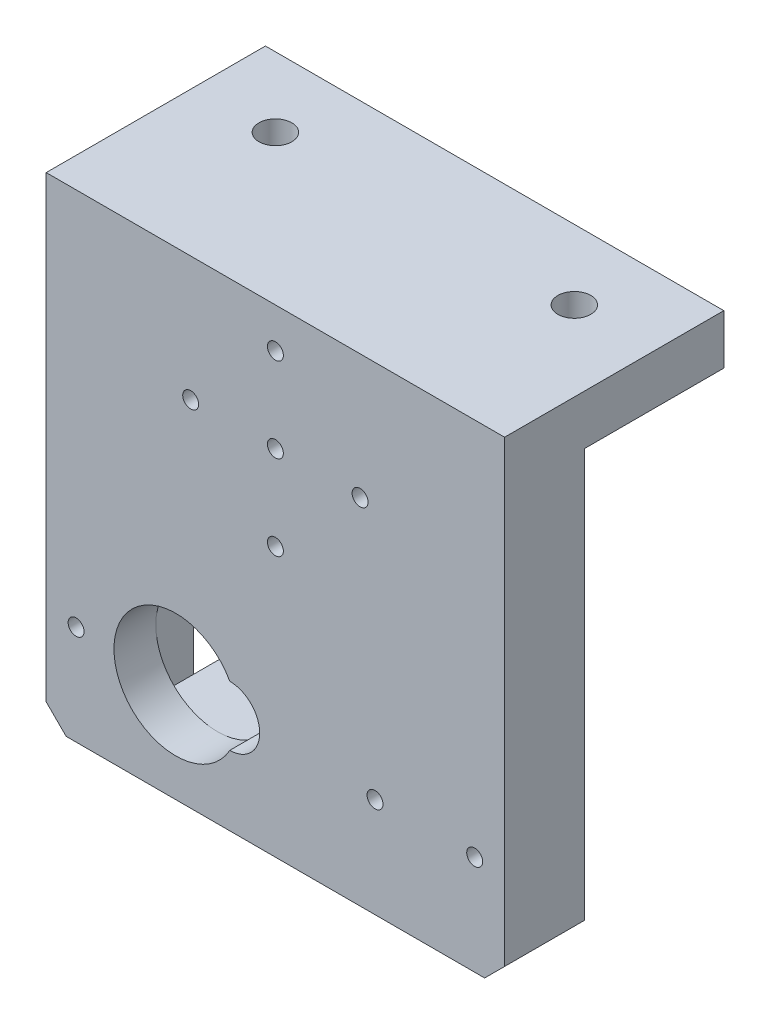
ISO-10303-21;
HEADER;
FILE_DESCRIPTION(('STEP AP214'),'2;1');
FILE_NAME('part.step','',(''),(''),'','','');
FILE_SCHEMA(('AUTOMOTIVE_DESIGN { 1 0 10303 214 1 1 1 1 }'));
ENDSEC;
DATA;
#1=APPLICATION_CONTEXT('core data for automotive mechanical design processes');
#2=APPLICATION_PROTOCOL_DEFINITION('international standard','automotive_design',2000,#1);
#3=PRODUCT_CONTEXT('',#1,'mechanical');
#4=PRODUCT('Part','Part','',(#3));
#5=PRODUCT_RELATED_PRODUCT_CATEGORY('part','',(#4));
#6=PRODUCT_DEFINITION_FORMATION('','',#4);
#7=PRODUCT_DEFINITION_CONTEXT('part definition',#1,'design');
#8=PRODUCT_DEFINITION('design','',#6,#7);
#9=PRODUCT_DEFINITION_SHAPE('','',#8);
#10=(LENGTH_UNIT() NAMED_UNIT(*) SI_UNIT(.MILLI.,.METRE.));
#11=(NAMED_UNIT(*) PLANE_ANGLE_UNIT() SI_UNIT($,.RADIAN.));
#12=(NAMED_UNIT(*) SI_UNIT($,.STERADIAN.) SOLID_ANGLE_UNIT());
#13=UNCERTAINTY_MEASURE_WITH_UNIT(LENGTH_MEASURE(1.E-05),#10,'distance_accuracy_value','');
#14=(GEOMETRIC_REPRESENTATION_CONTEXT(3) GLOBAL_UNCERTAINTY_ASSIGNED_CONTEXT((#13)) GLOBAL_UNIT_ASSIGNED_CONTEXT((#10,
#11,#12)) REPRESENTATION_CONTEXT('',''));
#15=CARTESIAN_POINT('',(0.,0.,0.));
#16=DIRECTION('',(0.,0.,1.));
#17=DIRECTION('',(1.,0.,0.));
#18=AXIS2_PLACEMENT_3D('',#15,#16,#17);
#19=CARTESIAN_POINT('',(0.,0.,0.));
#20=DIRECTION('',(0.,0.,-1.));
#21=DIRECTION('',(-1.,0.,0.));
#22=AXIS2_PLACEMENT_3D('',#19,#20,#21);
#23=PLANE('',#22);
#24=CARTESIAN_POINT('',(-20.,-14.,0.));
#25=DIRECTION('',(0.,0.,1.));
#26=DIRECTION('',(1.,0.,0.));
#27=AXIS2_PLACEMENT_3D('',#24,#25,#26);
#28=CIRCLE('',#27,0.799999999999997);
#29=CARTESIAN_POINT('',(-19.2,-14.,0.));
#30=VERTEX_POINT('',#29);
#31=EDGE_CURVE('E418',#30,#30,#28,.T.);
#32=ORIENTED_EDGE('',*,*,#31,.T.);
#33=EDGE_LOOP('',(#32));
#34=FACE_BOUND('',#33,.T.);
#35=CARTESIAN_POINT('',(10.,-14.,0.));
#36=DIRECTION('',(0.,0.,-1.));
#37=DIRECTION('',(-1.,0.,0.));
#38=AXIS2_PLACEMENT_3D('',#35,#36,#37);
#39=CIRCLE('',#38,0.799999999999996);
#40=CARTESIAN_POINT('',(9.2,-14.,0.));
#41=VERTEX_POINT('',#40);
#42=EDGE_CURVE('E342',#41,#41,#39,.T.);
#43=ORIENTED_EDGE('',*,*,#42,.F.);
#44=EDGE_LOOP('',(#43));
#45=FACE_BOUND('',#44,.T.);
#46=CARTESIAN_POINT('',(20.,-14.,0.));
#47=DIRECTION('',(0.,0.,-1.));
#48=DIRECTION('',(-1.,0.,0.));
#49=AXIS2_PLACEMENT_3D('',#46,#47,#48);
#50=CIRCLE('',#49,0.799999999999997);
#51=CARTESIAN_POINT('',(19.2,-14.,0.));
#52=VERTEX_POINT('',#51);
#53=EDGE_CURVE('E346',#52,#52,#50,.T.);
#54=ORIENTED_EDGE('',*,*,#53,.F.);
#55=EDGE_LOOP('',(#54));
#56=FACE_BOUND('',#55,.T.);
#57=DIRECTION('',(0.,-1.,0.));
#58=VECTOR('',#57,1.);
#59=CARTESIAN_POINT('',(7.8,-7.8,0.));
#60=LINE('',#59,#58);
#61=CARTESIAN_POINT('',(7.8,-7.8,0.));
#62=VERTEX_POINT('',#61);
#63=CARTESIAN_POINT('',(7.8,-20.2,0.));
#64=VERTEX_POINT('',#63);
#65=EDGE_CURVE('E293',#62,#64,#60,.T.);
#66=ORIENTED_EDGE('',*,*,#65,.F.);
#67=DIRECTION('',(0.,-1.,0.));
#68=VECTOR('',#67,1.);
#69=CARTESIAN_POINT('',(7.8,-7.8,0.));
#70=LINE('',#69,#68);
#71=CARTESIAN_POINT('',(7.8,-3.8,0.));
#72=VERTEX_POINT('',#71);
#73=EDGE_CURVE('E255',#72,#62,#70,.T.);
#74=ORIENTED_EDGE('',*,*,#73,.F.);
#75=DIRECTION('',(1.,0.,0.));
#76=VECTOR('',#75,1.);
#77=CARTESIAN_POINT('',(7.8,-3.8,0.));
#78=LINE('',#77,#76);
#79=CARTESIAN_POINT('',(-16.2,-3.8,0.));
#80=VERTEX_POINT('',#79);
#81=EDGE_CURVE('E248',#80,#72,#78,.T.);
#82=ORIENTED_EDGE('',*,*,#81,.F.);
#83=DIRECTION('',(0.,1.,0.));
#84=VECTOR('',#83,1.);
#85=CARTESIAN_POINT('',(-16.2,-7.8,0.));
#86=LINE('',#85,#84);
#87=CARTESIAN_POINT('',(-16.2,-7.8,0.));
#88=VERTEX_POINT('',#87);
#89=EDGE_CURVE('E257',#88,#80,#86,.T.);
#90=ORIENTED_EDGE('',*,*,#89,.F.);
#91=DIRECTION('',(0.,1.,0.));
#92=VECTOR('',#91,1.);
#93=CARTESIAN_POINT('',(-16.2,-7.8,0.));
#94=LINE('',#93,#92);
#95=CARTESIAN_POINT('',(-16.2,-20.2,0.));
#96=VERTEX_POINT('',#95);
#97=EDGE_CURVE('E298',#96,#88,#94,.T.);
#98=ORIENTED_EDGE('',*,*,#97,.F.);
#99=DIRECTION('',(0.,1.,0.));
#100=VECTOR('',#99,1.);
#101=CARTESIAN_POINT('',(-16.2,-20.2,0.));
#102=LINE('',#101,#100);
#103=CARTESIAN_POINT('',(-16.2,-24.,0.));
#104=VERTEX_POINT('',#103);
#105=EDGE_CURVE('E275',#104,#96,#102,.T.);
#106=ORIENTED_EDGE('',*,*,#105,.F.);
#107=DIRECTION('',(1.,0.,0.));
#108=VECTOR('',#107,1.);
#109=CARTESIAN_POINT('',(-23.,-24.,0.));
#110=LINE('',#109,#108);
#111=CARTESIAN_POINT('',(-21.,-24.,0.));
#112=VERTEX_POINT('',#111);
#113=EDGE_CURVE('E379',#112,#104,#110,.T.);
#114=ORIENTED_EDGE('',*,*,#113,.F.);
#115=DIRECTION('',(0.707106781186548,-0.707106781186548,0.));
#116=VECTOR('',#115,1.);
#117=CARTESIAN_POINT('',(-22.5,-22.5,0.));
#118=LINE('',#117,#116);
#119=CARTESIAN_POINT('',(-23.,-22.,0.));
#120=VERTEX_POINT('',#119);
#121=EDGE_CURVE('E406',#112,#120,#118,.F.);
#122=ORIENTED_EDGE('',*,*,#121,.T.);
#123=DIRECTION('',(0.,-1.,0.));
#124=VECTOR('',#123,1.);
#125=CARTESIAN_POINT('',(-23.,-24.,0.));
#126=LINE('',#125,#124);
#127=CARTESIAN_POINT('',(-23.,19.,0.));
#128=VERTEX_POINT('',#127);
#129=EDGE_CURVE('E390',#128,#120,#126,.T.);
#130=ORIENTED_EDGE('',*,*,#129,.F.);
#131=DIRECTION('',(-1.,0.,0.));
#132=VECTOR('',#131,1.);
#133=CARTESIAN_POINT('',(23.,19.,0.));
#134=LINE('',#133,#132);
#135=CARTESIAN_POINT('',(23.,19.,0.));
#136=VERTEX_POINT('',#135);
#137=EDGE_CURVE('E359',#136,#128,#134,.T.);
#138=ORIENTED_EDGE('',*,*,#137,.F.);
#139=DIRECTION('',(0.,1.,0.));
#140=VECTOR('',#139,1.);
#141=CARTESIAN_POINT('',(23.,-24.,0.));
#142=LINE('',#141,#140);
#143=CARTESIAN_POINT('',(23.,-22.,0.));
#144=VERTEX_POINT('',#143);
#145=EDGE_CURVE('E375',#144,#136,#142,.T.);
#146=ORIENTED_EDGE('',*,*,#145,.F.);
#147=DIRECTION('',(0.707106781186548,0.707106781186548,0.));
#148=VECTOR('',#147,1.);
#149=CARTESIAN_POINT('',(22.5,-22.5,0.));
#150=LINE('',#149,#148);
#151=CARTESIAN_POINT('',(21.,-24.,0.));
#152=VERTEX_POINT('',#151);
#153=EDGE_CURVE('E403',#144,#152,#150,.F.);
#154=ORIENTED_EDGE('',*,*,#153,.T.);
#155=CARTESIAN_POINT('',(7.8,-24.,0.));
#156=VERTEX_POINT('',#155);
#157=EDGE_CURVE('E392',#156,#152,#110,.T.);
#158=ORIENTED_EDGE('',*,*,#157,.F.);
#159=DIRECTION('',(0.,-1.,0.));
#160=VECTOR('',#159,1.);
#161=CARTESIAN_POINT('',(7.8,-20.2,0.));
#162=LINE('',#161,#160);
#163=EDGE_CURVE('E270',#64,#156,#162,.T.);
#164=ORIENTED_EDGE('',*,*,#163,.F.);
#165=EDGE_LOOP('',(#66,#74,#82,#90,#98,#106,#114,#122,#130,#138,#146,#154,#158,#164));
#166=FACE_BOUND('',#165,.T.);
#167=ADVANCED_FACE('F41',(#34,#45,#56,#166),#23,.T.);
#168=CARTESIAN_POINT('',(-10.,-14.,-15.));
#169=DIRECTION('',(0.,0.,1.));
#170=DIRECTION('',(1.,0.,0.));
#171=AXIS2_PLACEMENT_3D('',#168,#169,#170);
#172=CYLINDRICAL_SURFACE('',#171,6.2);
#173=CARTESIAN_POINT('',(-10.,-14.,3.8));
#174=DIRECTION('',(0.,0.,-1.));
#175=DIRECTION('',(-1.,0.,0.));
#176=AXIS2_PLACEMENT_3D('',#173,#174,#175);
#177=CIRCLE('',#176,6.2);
#178=CARTESIAN_POINT('',(-10.,-20.2,3.8));
#179=VERTEX_POINT('',#178);
#180=CARTESIAN_POINT('',(-4.57413601349978,-17.,3.8));
#181=VERTEX_POINT('',#180);
#182=EDGE_CURVE('E328',#179,#181,#177,.F.);
#183=ORIENTED_EDGE('',*,*,#182,.F.);
#184=CARTESIAN_POINT('',(-16.2,-14.,3.8));
#185=VERTEX_POINT('',#184);
#186=EDGE_CURVE('E452',#185,#179,#177,.F.);
#187=ORIENTED_EDGE('',*,*,#186,.F.);
#188=CARTESIAN_POINT('',(-10.,-7.8,3.8));
#189=VERTEX_POINT('',#188);
#190=EDGE_CURVE('E329',#189,#185,#177,.F.);
#191=ORIENTED_EDGE('',*,*,#190,.F.);
#192=CARTESIAN_POINT('',(-4.57413601349978,-11.,3.8));
#193=VERTEX_POINT('',#192);
#194=EDGE_CURVE('E318',#193,#189,#177,.F.);
#195=ORIENTED_EDGE('',*,*,#194,.F.);
#196=DIRECTION('',(0.,0.,1.));
#197=VECTOR('',#196,1.);
#198=CARTESIAN_POINT('',(-4.57413601349978,-11.,-15.));
#199=LINE('',#198,#197);
#200=CARTESIAN_POINT('',(-4.57413601349978,-11.,8.));
#201=VERTEX_POINT('',#200);
#202=EDGE_CURVE('E334',#193,#201,#199,.T.);
#203=ORIENTED_EDGE('',*,*,#202,.T.);
#204=CARTESIAN_POINT('',(-10.,-14.,8.));
#205=DIRECTION('',(0.,0.,1.));
#206=DIRECTION('',(1.,0.,0.));
#207=AXIS2_PLACEMENT_3D('',#204,#205,#206);
#208=CIRCLE('',#207,6.2);
#209=CARTESIAN_POINT('',(-4.57413601349978,-17.,8.));
#210=VERTEX_POINT('',#209);
#211=EDGE_CURVE('E330',#201,#210,#208,.T.);
#212=ORIENTED_EDGE('',*,*,#211,.T.);
#213=DIRECTION('',(0.,0.,1.));
#214=VECTOR('',#213,1.);
#215=CARTESIAN_POINT('',(-4.57413601349978,-17.,-15.));
#216=LINE('',#215,#214);
#217=EDGE_CURVE('E333',#181,#210,#216,.T.);
#218=ORIENTED_EDGE('',*,*,#217,.F.);
#219=EDGE_LOOP('',(#183,#187,#191,#195,#203,#212,#218));
#220=FACE_BOUND('',#219,.T.);
#221=ADVANCED_FACE('F442',(#220),#172,.F.);
#222=CARTESIAN_POINT('',(-20.,-14.,8.));
#223=DIRECTION('',(0.,0.,1.));
#224=DIRECTION('',(-1.,0.,0.));
#225=AXIS2_PLACEMENT_3D('',#222,#223,#224);
#226=CYLINDRICAL_SURFACE('',#225,0.799999999999997);
#227=ORIENTED_EDGE('',*,*,#31,.F.);
#228=EDGE_LOOP('',(#227));
#229=FACE_BOUND('',#228,.T.);
#230=CARTESIAN_POINT('',(-20.,-14.,8.));
#231=DIRECTION('',(0.,0.,-1.));
#232=DIRECTION('',(-1.,0.,0.));
#233=AXIS2_PLACEMENT_3D('',#230,#231,#232);
#234=CIRCLE('',#233,0.799999999999999);
#235=CARTESIAN_POINT('',(-20.8,-14.,8.));
#236=VERTEX_POINT('',#235);
#237=EDGE_CURVE('E429',#236,#236,#234,.T.);
#238=ORIENTED_EDGE('',*,*,#237,.F.);
#239=EDGE_LOOP('',(#238));
#240=FACE_BOUND('',#239,.T.);
#241=ADVANCED_FACE('F526',(#229,#240),#226,.F.);
#242=CARTESIAN_POINT('',(23.,-24.,8.));
#243=DIRECTION('',(-1.,0.,0.));
#244=DIRECTION('',(0.,0.,1.));
#245=AXIS2_PLACEMENT_3D('',#242,#243,#244);
#246=PLANE('',#245);
#247=DIRECTION('',(0.,1.,0.));
#248=VECTOR('',#247,1.);
#249=CARTESIAN_POINT('',(23.,-24.,8.));
#250=LINE('',#249,#248);
#251=CARTESIAN_POINT('',(23.,-22.,8.));
#252=VERTEX_POINT('',#251);
#253=CARTESIAN_POINT('',(23.,24.,8.));
#254=VERTEX_POINT('',#253);
#255=EDGE_CURVE('E376',#252,#254,#250,.T.);
#256=ORIENTED_EDGE('',*,*,#255,.F.);
#257=DIRECTION('',(0.,0.,-1.));
#258=VECTOR('',#257,1.);
#259=CARTESIAN_POINT('',(23.,-22.,8.));
#260=LINE('',#259,#258);
#261=EDGE_CURVE('E415',#252,#144,#260,.T.);
#262=ORIENTED_EDGE('',*,*,#261,.T.);
#263=ORIENTED_EDGE('',*,*,#145,.T.);
#264=DIRECTION('',(0.,0.,1.));
#265=VECTOR('',#264,1.);
#266=CARTESIAN_POINT('',(23.,19.,-14.));
#267=LINE('',#266,#265);
#268=CARTESIAN_POINT('',(23.,19.,-14.));
#269=VERTEX_POINT('',#268);
#270=EDGE_CURVE('E372',#269,#136,#267,.T.);
#271=ORIENTED_EDGE('',*,*,#270,.F.);
#272=DIRECTION('',(0.,-1.,0.));
#273=VECTOR('',#272,1.);
#274=CARTESIAN_POINT('',(23.,24.,-14.));
#275=LINE('',#274,#273);
#276=CARTESIAN_POINT('',(23.,24.,-14.));
#277=VERTEX_POINT('',#276);
#278=EDGE_CURVE('E355',#277,#269,#275,.T.);
#279=ORIENTED_EDGE('',*,*,#278,.F.);
#280=DIRECTION('',(0.,0.,-1.));
#281=VECTOR('',#280,1.);
#282=CARTESIAN_POINT('',(23.,24.,8.));
#283=LINE('',#282,#281);
#284=EDGE_CURVE('E396',#254,#277,#283,.T.);
#285=ORIENTED_EDGE('',*,*,#284,.F.);
#286=EDGE_LOOP('',(#256,#262,#263,#271,#279,#285));
#287=FACE_BOUND('',#286,.T.);
#288=ADVANCED_FACE('F543',(#287),#246,.F.);
#289=CARTESIAN_POINT('',(-23.,24.,8.));
#290=DIRECTION('',(0.,-1.,0.));
#291=DIRECTION('',(0.,0.,-1.));
#292=AXIS2_PLACEMENT_3D('',#289,#290,#291);
#293=PLANE('',#292);
#294=CARTESIAN_POINT('',(15.,24.,-7.));
#295=DIRECTION('',(0.,1.,0.));
#296=DIRECTION('',(0.,0.,1.));
#297=AXIS2_PLACEMENT_3D('',#294,#295,#296);
#298=CIRCLE('',#297,1.65);
#299=CARTESIAN_POINT('',(15.,24.,-5.35));
#300=VERTEX_POINT('',#299);
#301=EDGE_CURVE('E347',#300,#300,#298,.T.);
#302=ORIENTED_EDGE('',*,*,#301,.F.);
#303=EDGE_LOOP('',(#302));
#304=FACE_BOUND('',#303,.T.);
#305=CARTESIAN_POINT('',(-15.,24.,-7.));
#306=DIRECTION('',(0.,1.,0.));
#307=DIRECTION('',(0.,0.,1.));
#308=AXIS2_PLACEMENT_3D('',#305,#306,#307);
#309=CIRCLE('',#308,1.65);
#310=CARTESIAN_POINT('',(-15.,24.,-5.35));
#311=VERTEX_POINT('',#310);
#312=EDGE_CURVE('E351',#311,#311,#309,.T.);
#313=ORIENTED_EDGE('',*,*,#312,.F.);
#314=EDGE_LOOP('',(#313));
#315=FACE_BOUND('',#314,.T.);
#316=ORIENTED_EDGE('',*,*,#284,.T.);
#317=DIRECTION('',(1.,0.,0.));
#318=VECTOR('',#317,1.);
#319=CARTESIAN_POINT('',(23.,24.,-14.));
#320=LINE('',#319,#318);
#321=CARTESIAN_POINT('',(-23.,24.,-14.));
#322=VERTEX_POINT('',#321);
#323=EDGE_CURVE('E364',#322,#277,#320,.T.);
#324=ORIENTED_EDGE('',*,*,#323,.F.);
#325=DIRECTION('',(0.,0.,-1.));
#326=VECTOR('',#325,1.);
#327=CARTESIAN_POINT('',(-23.,24.,8.));
#328=LINE('',#327,#326);
#329=CARTESIAN_POINT('',(-23.,24.,8.));
#330=VERTEX_POINT('',#329);
#331=EDGE_CURVE('E387',#330,#322,#328,.T.);
#332=ORIENTED_EDGE('',*,*,#331,.F.);
#333=DIRECTION('',(-1.,0.,0.));
#334=VECTOR('',#333,1.);
#335=CARTESIAN_POINT('',(-23.,24.,8.));
#336=LINE('',#335,#334);
#337=EDGE_CURVE('E378',#254,#330,#336,.T.);
#338=ORIENTED_EDGE('',*,*,#337,.F.);
#339=EDGE_LOOP('',(#316,#324,#332,#338));
#340=FACE_BOUND('',#339,.T.);
#341=ADVANCED_FACE('F539',(#304,#315,#340),#293,.F.);
#342=CARTESIAN_POINT('',(-23.,-24.,8.));
#343=DIRECTION('',(1.,0.,0.));
#344=DIRECTION('',(0.,0.,-1.));
#345=AXIS2_PLACEMENT_3D('',#342,#343,#344);
#346=PLANE('',#345);
#347=ORIENTED_EDGE('',*,*,#331,.T.);
#348=DIRECTION('',(0.,1.,0.));
#349=VECTOR('',#348,1.);
#350=CARTESIAN_POINT('',(-23.,24.,-14.));
#351=LINE('',#350,#349);
#352=CARTESIAN_POINT('',(-23.,19.,-14.));
#353=VERTEX_POINT('',#352);
#354=EDGE_CURVE('E361',#353,#322,#351,.T.);
#355=ORIENTED_EDGE('',*,*,#354,.F.);
#356=DIRECTION('',(0.,0.,1.));
#357=VECTOR('',#356,1.);
#358=CARTESIAN_POINT('',(-23.,19.,-14.));
#359=LINE('',#358,#357);
#360=EDGE_CURVE('E367',#353,#128,#359,.T.);
#361=ORIENTED_EDGE('',*,*,#360,.T.);
#362=ORIENTED_EDGE('',*,*,#129,.T.);
#363=DIRECTION('',(0.,0.,1.));
#364=VECTOR('',#363,1.);
#365=CARTESIAN_POINT('',(-23.,-22.,8.));
#366=LINE('',#365,#364);
#367=CARTESIAN_POINT('',(-23.,-22.,8.));
#368=VERTEX_POINT('',#367);
#369=EDGE_CURVE('E409',#120,#368,#366,.T.);
#370=ORIENTED_EDGE('',*,*,#369,.T.);
#371=DIRECTION('',(0.,-1.,0.));
#372=VECTOR('',#371,1.);
#373=CARTESIAN_POINT('',(-23.,-24.,8.));
#374=LINE('',#373,#372);
#375=EDGE_CURVE('E381',#330,#368,#374,.T.);
#376=ORIENTED_EDGE('',*,*,#375,.F.);
#377=EDGE_LOOP('',(#347,#355,#361,#362,#370,#376));
#378=FACE_BOUND('',#377,.T.);
#379=ADVANCED_FACE('F535',(#378),#346,.F.);
#380=CARTESIAN_POINT('',(-23.,-24.,8.));
#381=DIRECTION('',(0.,1.,0.));
#382=DIRECTION('',(0.,0.,1.));
#383=AXIS2_PLACEMENT_3D('',#380,#381,#382);
#384=PLANE('',#383);
#385=DIRECTION('',(1.,0.,0.));
#386=VECTOR('',#385,1.);
#387=CARTESIAN_POINT('',(-23.,-24.,8.));
#388=LINE('',#387,#386);
#389=CARTESIAN_POINT('',(-21.,-24.,8.));
#390=VERTEX_POINT('',#389);
#391=CARTESIAN_POINT('',(21.,-24.,8.));
#392=VERTEX_POINT('',#391);
#393=EDGE_CURVE('E384',#390,#392,#388,.T.);
#394=ORIENTED_EDGE('',*,*,#393,.F.);
#395=DIRECTION('',(0.,0.,-1.));
#396=VECTOR('',#395,1.);
#397=CARTESIAN_POINT('',(-21.,-24.,8.));
#398=LINE('',#397,#396);
#399=EDGE_CURVE('E400',#390,#112,#398,.T.);
#400=ORIENTED_EDGE('',*,*,#399,.T.);
#401=ORIENTED_EDGE('',*,*,#113,.T.);
#402=DIRECTION('',(0.,0.,1.));
#403=VECTOR('',#402,1.);
#404=CARTESIAN_POINT('',(-16.2,-24.,-15.));
#405=LINE('',#404,#403);
#406=CARTESIAN_POINT('',(-16.2,-24.,-15.));
#407=VERTEX_POINT('',#406);
#408=EDGE_CURVE('E289',#407,#104,#405,.T.);
#409=ORIENTED_EDGE('',*,*,#408,.F.);
#410=DIRECTION('',(-1.,0.,0.));
#411=VECTOR('',#410,1.);
#412=CARTESIAN_POINT('',(7.8,-24.,-15.));
#413=LINE('',#412,#411);
#414=CARTESIAN_POINT('',(7.8,-24.,-15.));
#415=VERTEX_POINT('',#414);
#416=EDGE_CURVE('E274',#415,#407,#413,.T.);
#417=ORIENTED_EDGE('',*,*,#416,.F.);
#418=DIRECTION('',(0.,0.,1.));
#419=VECTOR('',#418,1.);
#420=CARTESIAN_POINT('',(7.8,-24.,-15.));
#421=LINE('',#420,#419);
#422=EDGE_CURVE('E291',#415,#156,#421,.T.);
#423=ORIENTED_EDGE('',*,*,#422,.T.);
#424=ORIENTED_EDGE('',*,*,#157,.T.);
#425=DIRECTION('',(0.,0.,1.));
#426=VECTOR('',#425,1.);
#427=CARTESIAN_POINT('',(21.,-24.,8.));
#428=LINE('',#427,#426);
#429=EDGE_CURVE('E398',#152,#392,#428,.T.);
#430=ORIENTED_EDGE('',*,*,#429,.T.);
#431=EDGE_LOOP('',(#394,#400,#401,#409,#417,#423,#424,#430));
#432=FACE_BOUND('',#431,.T.);
#433=ADVANCED_FACE('F532',(#432),#384,.F.);
#434=CARTESIAN_POINT('',(0.,0.,8.));
#435=DIRECTION('',(0.,0.,-1.));
#436=DIRECTION('',(-1.,0.,0.));
#437=AXIS2_PLACEMENT_3D('',#434,#435,#436);
#438=PLANE('',#437);
#439=CARTESIAN_POINT('',(0.,20.,8.));
#440=DIRECTION('',(0.,0.,1.));
#441=DIRECTION('',(1.,0.,0.));
#442=AXIS2_PLACEMENT_3D('',#439,#440,#441);
#443=CIRCLE('',#442,0.79999999999999);
#444=CARTESIAN_POINT('',(0.799999999999961,20.,8.));
#445=VERTEX_POINT('',#444);
#446=EDGE_CURVE('E216',#445,#445,#443,.T.);
#447=ORIENTED_EDGE('',*,*,#446,.F.);
#448=EDGE_LOOP('',(#447));
#449=FACE_BOUND('',#448,.T.);
#450=CARTESIAN_POINT('',(8.5,11.5,8.));
#451=DIRECTION('',(0.,0.,1.));
#452=DIRECTION('',(1.,0.,0.));
#453=AXIS2_PLACEMENT_3D('',#450,#451,#452);
#454=CIRCLE('',#453,0.79999999999999);
#455=CARTESIAN_POINT('',(9.29999999999999,11.5,8.));
#456=VERTEX_POINT('',#455);
#457=EDGE_CURVE('E215',#456,#456,#454,.T.);
#458=ORIENTED_EDGE('',*,*,#457,.F.);
#459=EDGE_LOOP('',(#458));
#460=FACE_BOUND('',#459,.T.);
#461=CARTESIAN_POINT('',(0.,2.99999999999995,8.));
#462=DIRECTION('',(0.,0.,1.));
#463=DIRECTION('',(1.,0.,0.));
#464=AXIS2_PLACEMENT_3D('',#461,#462,#463);
#465=CIRCLE('',#464,0.79999999999999);
#466=CARTESIAN_POINT('',(0.800000000000019,2.99999999999995,8.));
#467=VERTEX_POINT('',#466);
#468=EDGE_CURVE('E226',#467,#467,#465,.T.);
#469=ORIENTED_EDGE('',*,*,#468,.F.);
#470=EDGE_LOOP('',(#469));
#471=FACE_BOUND('',#470,.T.);
#472=CARTESIAN_POINT('',(-8.5,11.5,8.));
#473=DIRECTION('',(0.,0.,1.));
#474=DIRECTION('',(1.,0.,0.));
#475=AXIS2_PLACEMENT_3D('',#472,#473,#474);
#476=CIRCLE('',#475,0.79999999999999);
#477=CARTESIAN_POINT('',(-7.70000000000001,11.5,8.));
#478=VERTEX_POINT('',#477);
#479=EDGE_CURVE('E232',#478,#478,#476,.T.);
#480=ORIENTED_EDGE('',*,*,#479,.F.);
#481=EDGE_LOOP('',(#480));
#482=FACE_BOUND('',#481,.T.);
#483=CARTESIAN_POINT('',(0.,11.5,8.));
#484=DIRECTION('',(0.,0.,1.));
#485=DIRECTION('',(1.,0.,0.));
#486=AXIS2_PLACEMENT_3D('',#483,#484,#485);
#487=CIRCLE('',#486,0.79999999999999);
#488=CARTESIAN_POINT('',(0.79999999999999,11.5,8.));
#489=VERTEX_POINT('',#488);
#490=EDGE_CURVE('E238',#489,#489,#487,.T.);
#491=ORIENTED_EDGE('',*,*,#490,.F.);
#492=EDGE_LOOP('',(#491));
#493=FACE_BOUND('',#492,.T.);
#494=CARTESIAN_POINT('',(-4.57413601349979,-14.,8.));
#495=DIRECTION('',(0.,0.,-1.));
#496=DIRECTION('',(-1.,0.,0.));
#497=AXIS2_PLACEMENT_3D('',#494,#495,#496);
#498=CIRCLE('',#497,3.);
#499=CARTESIAN_POINT('',(-1.57413601349979,-14.,8.));
#500=VERTEX_POINT('',#499);
#501=EDGE_CURVE('E63',#201,#500,#498,.T.);
#502=ORIENTED_EDGE('',*,*,#501,.T.);
#503=CARTESIAN_POINT('',(-4.57413601349979,-14.,8.));
#504=DIRECTION('',(0.,0.,-1.));
#505=DIRECTION('',(-1.,0.,0.));
#506=AXIS2_PLACEMENT_3D('',#503,#504,#505);
#507=CIRCLE('',#506,3.);
#508=EDGE_CURVE('E50',#500,#210,#507,.T.);
#509=ORIENTED_EDGE('',*,*,#508,.T.);
#510=ORIENTED_EDGE('',*,*,#211,.F.);
#511=EDGE_LOOP('',(#502,#509,#510));
#512=FACE_BOUND('',#511,.T.);
#513=ORIENTED_EDGE('',*,*,#237,.T.);
#514=EDGE_LOOP('',(#513));
#515=FACE_BOUND('',#514,.T.);
#516=CARTESIAN_POINT('',(10.,-14.,8.));
#517=DIRECTION('',(0.,0.,1.));
#518=DIRECTION('',(1.,0.,0.));
#519=AXIS2_PLACEMENT_3D('',#516,#517,#518);
#520=CIRCLE('',#519,0.799999999999999);
#521=CARTESIAN_POINT('',(10.8,-14.,8.));
#522=VERTEX_POINT('',#521);
#523=EDGE_CURVE('E337',#522,#522,#520,.T.);
#524=ORIENTED_EDGE('',*,*,#523,.F.);
#525=EDGE_LOOP('',(#524));
#526=FACE_BOUND('',#525,.T.);
#527=CARTESIAN_POINT('',(20.,-14.,8.));
#528=DIRECTION('',(0.,0.,1.));
#529=DIRECTION('',(1.,0.,0.));
#530=AXIS2_PLACEMENT_3D('',#527,#528,#529);
#531=CIRCLE('',#530,0.799999999999999);
#532=CARTESIAN_POINT('',(20.8,-14.,8.));
#533=VERTEX_POINT('',#532);
#534=EDGE_CURVE('E343',#533,#533,#531,.T.);
#535=ORIENTED_EDGE('',*,*,#534,.F.);
#536=EDGE_LOOP('',(#535));
#537=FACE_BOUND('',#536,.T.);
#538=ORIENTED_EDGE('',*,*,#375,.T.);
#539=DIRECTION('',(-0.707106781186548,0.707106781186548,0.));
#540=VECTOR('',#539,1.);
#541=CARTESIAN_POINT('',(-21.,-24.,8.));
#542=LINE('',#541,#540);
#543=EDGE_CURVE('E413',#368,#390,#542,.F.);
#544=ORIENTED_EDGE('',*,*,#543,.T.);
#545=ORIENTED_EDGE('',*,*,#393,.T.);
#546=DIRECTION('',(-0.707106781186548,-0.707106781186548,0.));
#547=VECTOR('',#546,1.);
#548=CARTESIAN_POINT('',(23.,-22.,8.));
#549=LINE('',#548,#547);
#550=EDGE_CURVE('E411',#392,#252,#549,.F.);
#551=ORIENTED_EDGE('',*,*,#550,.T.);
#552=ORIENTED_EDGE('',*,*,#255,.T.);
#553=ORIENTED_EDGE('',*,*,#337,.T.);
#554=EDGE_LOOP('',(#538,#544,#545,#551,#552,#553));
#555=FACE_BOUND('',#554,.T.);
#556=ADVANCED_FACE('F435',(#449,#460,#471,#482,#493,#512,#515,#526,#537,#555),#438,.F.);
#557=CARTESIAN_POINT('',(-21.,-24.,8.));
#558=DIRECTION('',(0.707106781186547,0.707106781186547,0.));
#559=DIRECTION('',(0.,0.,-1.));
#560=AXIS2_PLACEMENT_3D('',#557,#558,#559);
#561=PLANE('',#560);
#562=ORIENTED_EDGE('',*,*,#543,.F.);
#563=ORIENTED_EDGE('',*,*,#369,.F.);
#564=ORIENTED_EDGE('',*,*,#121,.F.);
#565=ORIENTED_EDGE('',*,*,#399,.F.);
#566=EDGE_LOOP('',(#562,#563,#564,#565));
#567=FACE_BOUND('',#566,.T.);
#568=ADVANCED_FACE('F549',(#567),#561,.F.);
#569=CARTESIAN_POINT('',(23.,-22.,8.));
#570=DIRECTION('',(-0.707106781186547,0.707106781186547,0.));
#571=DIRECTION('',(0.,0.,-1.));
#572=AXIS2_PLACEMENT_3D('',#569,#570,#571);
#573=PLANE('',#572);
#574=ORIENTED_EDGE('',*,*,#550,.F.);
#575=ORIENTED_EDGE('',*,*,#429,.F.);
#576=ORIENTED_EDGE('',*,*,#153,.F.);
#577=ORIENTED_EDGE('',*,*,#261,.F.);
#578=EDGE_LOOP('',(#574,#575,#576,#577));
#579=FACE_BOUND('',#578,.T.);
#580=ADVANCED_FACE('F555',(#579),#573,.F.);
#581=CARTESIAN_POINT('',(23.,19.,-14.));
#582=DIRECTION('',(0.,1.,0.));
#583=DIRECTION('',(0.,0.,1.));
#584=AXIS2_PLACEMENT_3D('',#581,#582,#583);
#585=PLANE('',#584);
#586=CARTESIAN_POINT('',(15.,19.,-7.));
#587=DIRECTION('',(0.,1.,0.));
#588=DIRECTION('',(0.,0.,1.));
#589=AXIS2_PLACEMENT_3D('',#586,#587,#588);
#590=CIRCLE('',#589,1.65);
#591=CARTESIAN_POINT('',(15.,19.,-5.35));
#592=VERTEX_POINT('',#591);
#593=EDGE_CURVE('E350',#592,#592,#590,.T.);
#594=ORIENTED_EDGE('',*,*,#593,.T.);
#595=EDGE_LOOP('',(#594));
#596=FACE_BOUND('',#595,.T.);
#597=CARTESIAN_POINT('',(-15.,19.,-7.));
#598=DIRECTION('',(0.,1.,0.));
#599=DIRECTION('',(0.,0.,1.));
#600=AXIS2_PLACEMENT_3D('',#597,#598,#599);
#601=CIRCLE('',#600,1.65);
#602=CARTESIAN_POINT('',(-15.,19.,-5.35));
#603=VERTEX_POINT('',#602);
#604=EDGE_CURVE('E354',#603,#603,#601,.T.);
#605=ORIENTED_EDGE('',*,*,#604,.T.);
#606=EDGE_LOOP('',(#605));
#607=FACE_BOUND('',#606,.T.);
#608=ORIENTED_EDGE('',*,*,#137,.T.);
#609=ORIENTED_EDGE('',*,*,#360,.F.);
#610=DIRECTION('',(-1.,0.,0.));
#611=VECTOR('',#610,1.);
#612=CARTESIAN_POINT('',(23.,19.,-14.));
#613=LINE('',#612,#611);
#614=EDGE_CURVE('E358',#269,#353,#613,.T.);
#615=ORIENTED_EDGE('',*,*,#614,.F.);
#616=ORIENTED_EDGE('',*,*,#270,.T.);
#617=EDGE_LOOP('',(#608,#609,#615,#616));
#618=FACE_BOUND('',#617,.T.);
#619=ADVANCED_FACE('F561',(#596,#607,#618),#585,.F.);
#620=CARTESIAN_POINT('',(0.,0.,-14.));
#621=DIRECTION('',(0.,0.,-1.));
#622=DIRECTION('',(-1.,0.,0.));
#623=AXIS2_PLACEMENT_3D('',#620,#621,#622);
#624=PLANE('',#623);
#625=ORIENTED_EDGE('',*,*,#278,.T.);
#626=ORIENTED_EDGE('',*,*,#614,.T.);
#627=ORIENTED_EDGE('',*,*,#354,.T.);
#628=ORIENTED_EDGE('',*,*,#323,.T.);
#629=EDGE_LOOP('',(#625,#626,#627,#628));
#630=FACE_BOUND('',#629,.T.);
#631=ADVANCED_FACE('F649',(#630),#624,.T.);
#632=CARTESIAN_POINT('',(-15.,24.,-7.));
#633=DIRECTION('',(0.,1.,0.));
#634=DIRECTION('',(0.,0.,1.));
#635=AXIS2_PLACEMENT_3D('',#632,#633,#634);
#636=CYLINDRICAL_SURFACE('',#635,1.65);
#637=ORIENTED_EDGE('',*,*,#312,.T.);
#638=EDGE_LOOP('',(#637));
#639=FACE_BOUND('',#638,.T.);
#640=ORIENTED_EDGE('',*,*,#604,.F.);
#641=EDGE_LOOP('',(#640));
#642=FACE_BOUND('',#641,.T.);
#643=ADVANCED_FACE('F658',(#639,#642),#636,.F.);
#644=CARTESIAN_POINT('',(15.,24.,-7.));
#645=DIRECTION('',(0.,1.,0.));
#646=DIRECTION('',(0.,0.,1.));
#647=AXIS2_PLACEMENT_3D('',#644,#645,#646);
#648=CYLINDRICAL_SURFACE('',#647,1.65);
#649=ORIENTED_EDGE('',*,*,#301,.T.);
#650=EDGE_LOOP('',(#649));
#651=FACE_BOUND('',#650,.T.);
#652=ORIENTED_EDGE('',*,*,#593,.F.);
#653=EDGE_LOOP('',(#652));
#654=FACE_BOUND('',#653,.T.);
#655=ADVANCED_FACE('F667',(#651,#654),#648,.F.);
#656=CARTESIAN_POINT('',(20.,-14.,8.));
#657=DIRECTION('',(0.,0.,1.));
#658=DIRECTION('',(1.,0.,0.));
#659=AXIS2_PLACEMENT_3D('',#656,#657,#658);
#660=CYLINDRICAL_SURFACE('',#659,0.799999999999997);
#661=ORIENTED_EDGE('',*,*,#53,.T.);
#662=EDGE_LOOP('',(#661));
#663=FACE_BOUND('',#662,.T.);
#664=ORIENTED_EDGE('',*,*,#534,.T.);
#665=EDGE_LOOP('',(#664));
#666=FACE_BOUND('',#665,.T.);
#667=ADVANCED_FACE('F676',(#663,#666),#660,.F.);
#668=CARTESIAN_POINT('',(10.,-14.,8.));
#669=DIRECTION('',(0.,0.,1.));
#670=DIRECTION('',(1.,0.,0.));
#671=AXIS2_PLACEMENT_3D('',#668,#669,#670);
#672=CYLINDRICAL_SURFACE('',#671,0.799999999999996);
#673=ORIENTED_EDGE('',*,*,#42,.T.);
#674=EDGE_LOOP('',(#673));
#675=FACE_BOUND('',#674,.T.);
#676=ORIENTED_EDGE('',*,*,#523,.T.);
#677=EDGE_LOOP('',(#676));
#678=FACE_BOUND('',#677,.T.);
#679=ADVANCED_FACE('F685',(#675,#678),#672,.F.);
#680=CARTESIAN_POINT('',(7.8,-7.8,3.8));
#681=DIRECTION('',(0.,1.,0.));
#682=DIRECTION('',(0.,0.,1.));
#683=AXIS2_PLACEMENT_3D('',#680,#681,#682);
#684=PLANE('',#683);
#685=DIRECTION('',(1.,0.,0.));
#686=VECTOR('',#685,1.);
#687=CARTESIAN_POINT('',(7.8,-7.8,3.8));
#688=LINE('',#687,#686);
#689=CARTESIAN_POINT('',(-16.2,-7.8,3.8));
#690=VERTEX_POINT('',#689);
#691=EDGE_CURVE('E307',#690,#189,#688,.T.);
#692=ORIENTED_EDGE('',*,*,#691,.F.);
#693=DIRECTION('',(0.,0.,-1.));
#694=VECTOR('',#693,1.);
#695=CARTESIAN_POINT('',(-16.2,-7.8,3.8));
#696=LINE('',#695,#694);
#697=EDGE_CURVE('E319',#690,#88,#696,.T.);
#698=ORIENTED_EDGE('',*,*,#697,.T.);
#699=DIRECTION('',(0.,0.,1.));
#700=VECTOR('',#699,1.);
#701=CARTESIAN_POINT('',(-16.2,-7.8,-15.));
#702=LINE('',#701,#700);
#703=CARTESIAN_POINT('',(-16.2,-7.8,-15.));
#704=VERTEX_POINT('',#703);
#705=EDGE_CURVE('E265',#704,#88,#702,.T.);
#706=ORIENTED_EDGE('',*,*,#705,.F.);
#707=DIRECTION('',(-1.,0.,0.));
#708=VECTOR('',#707,1.);
#709=CARTESIAN_POINT('',(7.8,-7.8,-15.));
#710=LINE('',#709,#708);
#711=CARTESIAN_POINT('',(7.8,-7.8,-15.));
#712=VERTEX_POINT('',#711);
#713=EDGE_CURVE('E247',#712,#704,#710,.T.);
#714=ORIENTED_EDGE('',*,*,#713,.F.);
#715=DIRECTION('',(0.,0.,1.));
#716=VECTOR('',#715,1.);
#717=CARTESIAN_POINT('',(7.8,-7.8,-15.));
#718=LINE('',#717,#716);
#719=EDGE_CURVE('E267',#712,#62,#718,.T.);
#720=ORIENTED_EDGE('',*,*,#719,.T.);
#721=DIRECTION('',(0.,0.,-1.));
#722=VECTOR('',#721,1.);
#723=CARTESIAN_POINT('',(7.8,-7.8,3.8));
#724=LINE('',#723,#722);
#725=CARTESIAN_POINT('',(7.8,-7.8,3.8));
#726=VERTEX_POINT('',#725);
#727=EDGE_CURVE('E315',#726,#62,#724,.T.);
#728=ORIENTED_EDGE('',*,*,#727,.F.);
#729=EDGE_CURVE('E306',#189,#726,#688,.T.);
#730=ORIENTED_EDGE('',*,*,#729,.F.);
#731=EDGE_LOOP('',(#692,#698,#706,#714,#720,#728,#730));
#732=FACE_BOUND('',#731,.T.);
#733=ADVANCED_FACE('F471',(#732),#684,.F.);
#734=CARTESIAN_POINT('',(-16.2,-7.8,3.8));
#735=DIRECTION('',(-1.,0.,0.));
#736=DIRECTION('',(0.,0.,1.));
#737=AXIS2_PLACEMENT_3D('',#734,#735,#736);
#738=PLANE('',#737);
#739=DIRECTION('',(0.,1.,0.));
#740=VECTOR('',#739,1.);
#741=CARTESIAN_POINT('',(-16.2,-7.8,3.8));
#742=LINE('',#741,#740);
#743=CARTESIAN_POINT('',(-16.2,-20.2,3.8));
#744=VERTEX_POINT('',#743);
#745=EDGE_CURVE('E303',#744,#185,#742,.T.);
#746=ORIENTED_EDGE('',*,*,#745,.F.);
#747=DIRECTION('',(0.,0.,-1.));
#748=VECTOR('',#747,1.);
#749=CARTESIAN_POINT('',(-16.2,-20.2,3.8));
#750=LINE('',#749,#748);
#751=EDGE_CURVE('E322',#744,#96,#750,.T.);
#752=ORIENTED_EDGE('',*,*,#751,.T.);
#753=ORIENTED_EDGE('',*,*,#97,.T.);
#754=ORIENTED_EDGE('',*,*,#697,.F.);
#755=EDGE_CURVE('E302',#185,#690,#742,.T.);
#756=ORIENTED_EDGE('',*,*,#755,.F.);
#757=EDGE_LOOP('',(#746,#752,#753,#754,#756));
#758=FACE_BOUND('',#757,.T.);
#759=ADVANCED_FACE('F466',(#758),#738,.F.);
#760=CARTESIAN_POINT('',(7.8,-20.2,3.8));
#761=DIRECTION('',(0.,-1.,0.));
#762=DIRECTION('',(0.,0.,-1.));
#763=AXIS2_PLACEMENT_3D('',#760,#761,#762);
#764=PLANE('',#763);
#765=DIRECTION('',(-1.,0.,0.));
#766=VECTOR('',#765,1.);
#767=CARTESIAN_POINT('',(7.8,-20.2,3.8));
#768=LINE('',#767,#766);
#769=CARTESIAN_POINT('',(7.8,-20.2,3.8));
#770=VERTEX_POINT('',#769);
#771=EDGE_CURVE('E299',#770,#179,#768,.T.);
#772=ORIENTED_EDGE('',*,*,#771,.F.);
#773=DIRECTION('',(0.,0.,-1.));
#774=VECTOR('',#773,1.);
#775=CARTESIAN_POINT('',(7.8,-20.2,3.8));
#776=LINE('',#775,#774);
#777=EDGE_CURVE('E310',#770,#64,#776,.T.);
#778=ORIENTED_EDGE('',*,*,#777,.T.);
#779=DIRECTION('',(0.,0.,1.));
#780=VECTOR('',#779,1.);
#781=CARTESIAN_POINT('',(7.8,-20.2,-15.));
#782=LINE('',#781,#780);
#783=CARTESIAN_POINT('',(7.8,-20.2,-15.));
#784=VERTEX_POINT('',#783);
#785=EDGE_CURVE('E281',#784,#64,#782,.T.);
#786=ORIENTED_EDGE('',*,*,#785,.F.);
#787=DIRECTION('',(1.,0.,0.));
#788=VECTOR('',#787,1.);
#789=CARTESIAN_POINT('',(7.8,-20.2,-15.));
#790=LINE('',#789,#788);
#791=CARTESIAN_POINT('',(-16.2,-20.2,-15.));
#792=VERTEX_POINT('',#791);
#793=EDGE_CURVE('E279',#792,#784,#790,.T.);
#794=ORIENTED_EDGE('',*,*,#793,.F.);
#795=DIRECTION('',(0.,0.,1.));
#796=VECTOR('',#795,1.);
#797=CARTESIAN_POINT('',(-16.2,-20.2,-15.));
#798=LINE('',#797,#796);
#799=EDGE_CURVE('E287',#792,#96,#798,.T.);
#800=ORIENTED_EDGE('',*,*,#799,.T.);
#801=ORIENTED_EDGE('',*,*,#751,.F.);
#802=EDGE_CURVE('E297',#179,#744,#768,.T.);
#803=ORIENTED_EDGE('',*,*,#802,.F.);
#804=EDGE_LOOP('',(#772,#778,#786,#794,#800,#801,#803));
#805=FACE_BOUND('',#804,.T.);
#806=ADVANCED_FACE('F460',(#805),#764,.F.);
#807=CARTESIAN_POINT('',(0.,0.,3.8));
#808=DIRECTION('',(0.,0.,-1.));
#809=DIRECTION('',(-1.,0.,0.));
#810=AXIS2_PLACEMENT_3D('',#807,#808,#809);
#811=PLANE('',#810);
#812=ORIENTED_EDGE('',*,*,#190,.T.);
#813=ORIENTED_EDGE('',*,*,#755,.T.);
#814=ORIENTED_EDGE('',*,*,#691,.T.);
#815=EDGE_LOOP('',(#812,#813,#814));
#816=FACE_BOUND('',#815,.T.);
#817=ADVANCED_FACE('F469',(#816),#811,.T.);
#818=ORIENTED_EDGE('',*,*,#186,.T.);
#819=ORIENTED_EDGE('',*,*,#802,.T.);
#820=ORIENTED_EDGE('',*,*,#745,.T.);
#821=EDGE_LOOP('',(#818,#819,#820));
#822=FACE_BOUND('',#821,.T.);
#823=ADVANCED_FACE('F464',(#822),#811,.T.);
#824=ORIENTED_EDGE('',*,*,#182,.T.);
#825=CARTESIAN_POINT('',(-4.57413601349979,-14.,3.8));
#826=DIRECTION('',(0.,0.,-1.));
#827=DIRECTION('',(-1.,0.,0.));
#828=AXIS2_PLACEMENT_3D('',#825,#826,#827);
#829=CIRCLE('',#828,3.);
#830=CARTESIAN_POINT('',(-1.57413601349979,-14.,3.8));
#831=VERTEX_POINT('',#830);
#832=EDGE_CURVE('E11',#181,#831,#829,.F.);
#833=ORIENTED_EDGE('',*,*,#832,.T.);
#834=CARTESIAN_POINT('',(-4.57413601349979,-14.,3.8));
#835=DIRECTION('',(0.,0.,-1.));
#836=DIRECTION('',(-1.,0.,0.));
#837=AXIS2_PLACEMENT_3D('',#834,#835,#836);
#838=CIRCLE('',#837,3.);
#839=EDGE_CURVE('E433',#831,#193,#838,.F.);
#840=ORIENTED_EDGE('',*,*,#839,.T.);
#841=ORIENTED_EDGE('',*,*,#194,.T.);
#842=ORIENTED_EDGE('',*,*,#729,.T.);
#843=DIRECTION('',(0.,-1.,0.));
#844=VECTOR('',#843,1.);
#845=CARTESIAN_POINT('',(7.8,-7.8,3.8));
#846=LINE('',#845,#844);
#847=EDGE_CURVE('E294',#726,#770,#846,.T.);
#848=ORIENTED_EDGE('',*,*,#847,.T.);
#849=ORIENTED_EDGE('',*,*,#771,.T.);
#850=EDGE_LOOP('',(#824,#833,#840,#841,#842,#848,#849));
#851=FACE_BOUND('',#850,.T.);
#852=ADVANCED_FACE('F448',(#851),#811,.T.);
#853=CARTESIAN_POINT('',(7.8,-7.8,3.8));
#854=DIRECTION('',(1.,0.,0.));
#855=DIRECTION('',(0.,1.,0.));
#856=AXIS2_PLACEMENT_3D('',#853,#854,#855);
#857=PLANE('',#856);
#858=ORIENTED_EDGE('',*,*,#65,.T.);
#859=ORIENTED_EDGE('',*,*,#777,.F.);
#860=ORIENTED_EDGE('',*,*,#847,.F.);
#861=ORIENTED_EDGE('',*,*,#727,.T.);
#862=EDGE_LOOP('',(#858,#859,#860,#861));
#863=FACE_BOUND('',#862,.T.);
#864=ADVANCED_FACE('F477',(#863),#857,.F.);
#865=CARTESIAN_POINT('',(7.8,-20.2,-15.));
#866=DIRECTION('',(-1.,0.,0.));
#867=DIRECTION('',(0.,0.,1.));
#868=AXIS2_PLACEMENT_3D('',#865,#866,#867);
#869=PLANE('',#868);
#870=ORIENTED_EDGE('',*,*,#163,.T.);
#871=ORIENTED_EDGE('',*,*,#422,.F.);
#872=DIRECTION('',(0.,-1.,0.));
#873=VECTOR('',#872,1.);
#874=CARTESIAN_POINT('',(7.8,-20.2,-15.));
#875=LINE('',#874,#873);
#876=EDGE_CURVE('E271',#784,#415,#875,.T.);
#877=ORIENTED_EDGE('',*,*,#876,.F.);
#878=ORIENTED_EDGE('',*,*,#785,.T.);
#879=EDGE_LOOP('',(#870,#871,#877,#878));
#880=FACE_BOUND('',#879,.T.);
#881=ADVANCED_FACE('F485',(#880),#869,.F.);
#882=CARTESIAN_POINT('',(-16.2,-20.2,-15.));
#883=DIRECTION('',(1.,0.,0.));
#884=DIRECTION('',(0.,0.,-1.));
#885=AXIS2_PLACEMENT_3D('',#882,#883,#884);
#886=PLANE('',#885);
#887=ORIENTED_EDGE('',*,*,#105,.T.);
#888=ORIENTED_EDGE('',*,*,#799,.F.);
#889=DIRECTION('',(0.,1.,0.));
#890=VECTOR('',#889,1.);
#891=CARTESIAN_POINT('',(-16.2,-20.2,-15.));
#892=LINE('',#891,#890);
#893=EDGE_CURVE('E277',#407,#792,#892,.T.);
#894=ORIENTED_EDGE('',*,*,#893,.F.);
#895=ORIENTED_EDGE('',*,*,#408,.T.);
#896=EDGE_LOOP('',(#887,#888,#894,#895));
#897=FACE_BOUND('',#896,.T.);
#898=ADVANCED_FACE('F494',(#897),#886,.F.);
#899=CARTESIAN_POINT('',(0.,0.,-15.));
#900=DIRECTION('',(0.,0.,-1.));
#901=DIRECTION('',(-1.,0.,0.));
#902=AXIS2_PLACEMENT_3D('',#899,#900,#901);
#903=PLANE('',#902);
#904=ORIENTED_EDGE('',*,*,#876,.T.);
#905=ORIENTED_EDGE('',*,*,#416,.T.);
#906=ORIENTED_EDGE('',*,*,#893,.T.);
#907=ORIENTED_EDGE('',*,*,#793,.T.);
#908=EDGE_LOOP('',(#904,#905,#906,#907));
#909=FACE_BOUND('',#908,.T.);
#910=ADVANCED_FACE('F490',(#909),#903,.T.);
#911=CARTESIAN_POINT('',(7.8,-7.8,-15.));
#912=DIRECTION('',(-1.,0.,0.));
#913=DIRECTION('',(0.,0.,1.));
#914=AXIS2_PLACEMENT_3D('',#911,#912,#913);
#915=PLANE('',#914);
#916=ORIENTED_EDGE('',*,*,#73,.T.);
#917=ORIENTED_EDGE('',*,*,#719,.F.);
#918=DIRECTION('',(0.,-1.,0.));
#919=VECTOR('',#918,1.);
#920=CARTESIAN_POINT('',(7.8,-7.8,-15.));
#921=LINE('',#920,#919);
#922=CARTESIAN_POINT('',(7.8,-3.8,-15.));
#923=VERTEX_POINT('',#922);
#924=EDGE_CURVE('E244',#923,#712,#921,.T.);
#925=ORIENTED_EDGE('',*,*,#924,.F.);
#926=DIRECTION('',(0.,0.,1.));
#927=VECTOR('',#926,1.);
#928=CARTESIAN_POINT('',(7.8,-3.8,-15.));
#929=LINE('',#928,#927);
#930=EDGE_CURVE('E254',#923,#72,#929,.T.);
#931=ORIENTED_EDGE('',*,*,#930,.T.);
#932=EDGE_LOOP('',(#916,#917,#925,#931));
#933=FACE_BOUND('',#932,.T.);
#934=ADVANCED_FACE('F511',(#933),#915,.F.);
#935=CARTESIAN_POINT('',(-16.2,-7.8,-15.));
#936=DIRECTION('',(1.,0.,0.));
#937=DIRECTION('',(0.,0.,-1.));
#938=AXIS2_PLACEMENT_3D('',#935,#936,#937);
#939=PLANE('',#938);
#940=ORIENTED_EDGE('',*,*,#89,.T.);
#941=DIRECTION('',(0.,0.,1.));
#942=VECTOR('',#941,1.);
#943=CARTESIAN_POINT('',(-16.2,-3.8,-15.));
#944=LINE('',#943,#942);
#945=CARTESIAN_POINT('',(-16.2,-3.8,-15.));
#946=VERTEX_POINT('',#945);
#947=EDGE_CURVE('E262',#946,#80,#944,.T.);
#948=ORIENTED_EDGE('',*,*,#947,.F.);
#949=DIRECTION('',(0.,1.,0.));
#950=VECTOR('',#949,1.);
#951=CARTESIAN_POINT('',(-16.2,-7.8,-15.));
#952=LINE('',#951,#950);
#953=EDGE_CURVE('E250',#704,#946,#952,.T.);
#954=ORIENTED_EDGE('',*,*,#953,.F.);
#955=ORIENTED_EDGE('',*,*,#705,.T.);
#956=EDGE_LOOP('',(#940,#948,#954,#955));
#957=FACE_BOUND('',#956,.T.);
#958=ADVANCED_FACE('F501',(#957),#939,.F.);
#959=CARTESIAN_POINT('',(7.8,-3.8,-15.));
#960=DIRECTION('',(0.,-1.,0.));
#961=DIRECTION('',(0.,0.,-1.));
#962=AXIS2_PLACEMENT_3D('',#959,#960,#961);
#963=PLANE('',#962);
#964=ORIENTED_EDGE('',*,*,#81,.T.);
#965=ORIENTED_EDGE('',*,*,#930,.F.);
#966=DIRECTION('',(1.,0.,0.));
#967=VECTOR('',#966,1.);
#968=CARTESIAN_POINT('',(7.8,-3.8,-15.));
#969=LINE('',#968,#967);
#970=EDGE_CURVE('E252',#946,#923,#969,.T.);
#971=ORIENTED_EDGE('',*,*,#970,.F.);
#972=ORIENTED_EDGE('',*,*,#947,.T.);
#973=EDGE_LOOP('',(#964,#965,#971,#972));
#974=FACE_BOUND('',#973,.T.);
#975=ADVANCED_FACE('F505',(#974),#963,.F.);
#976=CARTESIAN_POINT('',(0.,0.,-15.));
#977=DIRECTION('',(0.,0.,1.));
#978=DIRECTION('',(1.,0.,0.));
#979=AXIS2_PLACEMENT_3D('',#976,#977,#978);
#980=PLANE('',#979);
#981=ORIENTED_EDGE('',*,*,#924,.T.);
#982=ORIENTED_EDGE('',*,*,#713,.T.);
#983=ORIENTED_EDGE('',*,*,#953,.T.);
#984=ORIENTED_EDGE('',*,*,#970,.T.);
#985=EDGE_LOOP('',(#981,#982,#983,#984));
#986=FACE_BOUND('',#985,.T.);
#987=ADVANCED_FACE('F509',(#986),#980,.F.);
#988=CARTESIAN_POINT('',(-4.57413601349979,-14.,-15.));
#989=DIRECTION('',(0.,0.,-1.));
#990=DIRECTION('',(-1.,0.,0.));
#991=AXIS2_PLACEMENT_3D('',#988,#989,#990);
#992=CYLINDRICAL_SURFACE('',#991,3.);
#993=DIRECTION('',(0.,0.,1.));
#994=VECTOR('',#993,1.);
#995=CARTESIAN_POINT('',(-1.57413601349979,-14.,8.));
#996=LINE('',#995,#994);
#997=EDGE_CURVE('E45',#831,#500,#996,.T.);
#998=ORIENTED_EDGE('',*,*,#997,.F.);
#999=ORIENTED_EDGE('',*,*,#832,.F.);
#1000=ORIENTED_EDGE('',*,*,#217,.T.);
#1001=ORIENTED_EDGE('',*,*,#508,.F.);
#1002=EDGE_LOOP('',(#998,#999,#1000,#1001));
#1003=FACE_BOUND('',#1002,.T.);
#1004=ADVANCED_FACE('F43',(#1003),#992,.F.);
#1005=CARTESIAN_POINT('',(-4.57413601349979,-14.,-15.));
#1006=DIRECTION('',(0.,0.,1.));
#1007=DIRECTION('',(1.,0.,0.));
#1008=AXIS2_PLACEMENT_3D('',#1005,#1006,#1007);
#1009=CYLINDRICAL_SURFACE('',#1008,3.);
#1010=ORIENTED_EDGE('',*,*,#839,.F.);
#1011=ORIENTED_EDGE('',*,*,#997,.T.);
#1012=ORIENTED_EDGE('',*,*,#501,.F.);
#1013=ORIENTED_EDGE('',*,*,#202,.F.);
#1014=EDGE_LOOP('',(#1010,#1011,#1012,#1013));
#1015=FACE_BOUND('',#1014,.T.);
#1016=ADVANCED_FACE('F447',(#1015),#1009,.F.);
#1017=CARTESIAN_POINT('',(0.,11.5,2.8));
#1018=DIRECTION('',(0.,0.,1.));
#1019=DIRECTION('',(1.,0.,0.));
#1020=AXIS2_PLACEMENT_3D('',#1017,#1018,#1019);
#1021=CONICAL_SURFACE('',#1020,0.799999999999988,1.02974425867664);
#1022=CARTESIAN_POINT('',(0.,11.5,2.31931150477795));
#1023=VERTEX_POINT('',#1022);
#1024=VERTEX_LOOP('',#1023);
#1025=FACE_BOUND('',#1024,.T.);
#1026=CARTESIAN_POINT('',(0.,11.5,2.8));
#1027=DIRECTION('',(0.,0.,1.));
#1028=DIRECTION('',(1.,0.,0.));
#1029=AXIS2_PLACEMENT_3D('',#1026,#1027,#1028);
#1030=CIRCLE('',#1029,0.799999999999988);
#1031=CARTESIAN_POINT('',(0.799999999999988,11.5,2.8));
#1032=VERTEX_POINT('',#1031);
#1033=EDGE_CURVE('E241',#1032,#1032,#1030,.T.);
#1034=ORIENTED_EDGE('',*,*,#1033,.T.);
#1035=EDGE_LOOP('',(#1034));
#1036=FACE_BOUND('',#1035,.T.);
#1037=ADVANCED_FACE('F566',(#1025,#1036),#1021,.F.);
#1038=CARTESIAN_POINT('',(0.,11.5,8.));
#1039=DIRECTION('',(0.,0.,1.));
#1040=DIRECTION('',(1.,0.,0.));
#1041=AXIS2_PLACEMENT_3D('',#1038,#1039,#1040);
#1042=CYLINDRICAL_SURFACE('',#1041,0.799999999999989);
#1043=ORIENTED_EDGE('',*,*,#1033,.F.);
#1044=EDGE_LOOP('',(#1043));
#1045=FACE_BOUND('',#1044,.T.);
#1046=ORIENTED_EDGE('',*,*,#490,.T.);
#1047=EDGE_LOOP('',(#1046));
#1048=FACE_BOUND('',#1047,.T.);
#1049=ADVANCED_FACE('F571',(#1045,#1048),#1042,.F.);
#1050=CARTESIAN_POINT('',(-8.5,11.5,2.8));
#1051=DIRECTION('',(0.,0.,1.));
#1052=DIRECTION('',(1.,0.,0.));
#1053=AXIS2_PLACEMENT_3D('',#1050,#1051,#1052);
#1054=CONICAL_SURFACE('',#1053,0.799999999999988,1.02974425867664);
#1055=CARTESIAN_POINT('',(-8.5,11.5,2.31931150477795));
#1056=VERTEX_POINT('',#1055);
#1057=VERTEX_LOOP('',#1056);
#1058=FACE_BOUND('',#1057,.T.);
#1059=CARTESIAN_POINT('',(-8.5,11.5,2.8));
#1060=DIRECTION('',(0.,0.,1.));
#1061=DIRECTION('',(1.,0.,0.));
#1062=AXIS2_PLACEMENT_3D('',#1059,#1060,#1061);
#1063=CIRCLE('',#1062,0.799999999999988);
#1064=CARTESIAN_POINT('',(-7.70000000000001,11.5,2.8));
#1065=VERTEX_POINT('',#1064);
#1066=EDGE_CURVE('E235',#1065,#1065,#1063,.T.);
#1067=ORIENTED_EDGE('',*,*,#1066,.T.);
#1068=EDGE_LOOP('',(#1067));
#1069=FACE_BOUND('',#1068,.T.);
#1070=ADVANCED_FACE('F585',(#1058,#1069),#1054,.F.);
#1071=CARTESIAN_POINT('',(-8.5,11.5,8.));
#1072=DIRECTION('',(0.,0.,1.));
#1073=DIRECTION('',(1.,0.,0.));
#1074=AXIS2_PLACEMENT_3D('',#1071,#1072,#1073);
#1075=CYLINDRICAL_SURFACE('',#1074,0.799999999999989);
#1076=ORIENTED_EDGE('',*,*,#1066,.F.);
#1077=EDGE_LOOP('',(#1076));
#1078=FACE_BOUND('',#1077,.T.);
#1079=ORIENTED_EDGE('',*,*,#479,.T.);
#1080=EDGE_LOOP('',(#1079));
#1081=FACE_BOUND('',#1080,.T.);
#1082=ADVANCED_FACE('F589',(#1078,#1081),#1075,.F.);
#1083=CARTESIAN_POINT('',(0.,2.99999999999995,2.8));
#1084=DIRECTION('',(0.,0.,1.));
#1085=DIRECTION('',(1.,0.,0.));
#1086=AXIS2_PLACEMENT_3D('',#1083,#1084,#1085);
#1087=CONICAL_SURFACE('',#1086,0.799999999999988,1.02974425867664);
#1088=CARTESIAN_POINT('',(0.,2.99999999999995,2.31931150477795));
#1089=VERTEX_POINT('',#1088);
#1090=VERTEX_LOOP('',#1089);
#1091=FACE_BOUND('',#1090,.T.);
#1092=CARTESIAN_POINT('',(0.,2.99999999999995,2.8));
#1093=DIRECTION('',(0.,0.,1.));
#1094=DIRECTION('',(1.,0.,0.));
#1095=AXIS2_PLACEMENT_3D('',#1092,#1093,#1094);
#1096=CIRCLE('',#1095,0.799999999999988);
#1097=CARTESIAN_POINT('',(0.800000000000017,2.99999999999995,2.8));
#1098=VERTEX_POINT('',#1097);
#1099=EDGE_CURVE('E229',#1098,#1098,#1096,.T.);
#1100=ORIENTED_EDGE('',*,*,#1099,.T.);
#1101=EDGE_LOOP('',(#1100));
#1102=FACE_BOUND('',#1101,.T.);
#1103=ADVANCED_FACE('F593',(#1091,#1102),#1087,.F.);
#1104=CARTESIAN_POINT('',(0.,2.99999999999995,8.));
#1105=DIRECTION('',(0.,0.,1.));
#1106=DIRECTION('',(1.,0.,0.));
#1107=AXIS2_PLACEMENT_3D('',#1104,#1105,#1106);
#1108=CYLINDRICAL_SURFACE('',#1107,0.799999999999989);
#1109=ORIENTED_EDGE('',*,*,#1099,.F.);
#1110=EDGE_LOOP('',(#1109));
#1111=FACE_BOUND('',#1110,.T.);
#1112=ORIENTED_EDGE('',*,*,#468,.T.);
#1113=EDGE_LOOP('',(#1112));
#1114=FACE_BOUND('',#1113,.T.);
#1115=ADVANCED_FACE('F597',(#1111,#1114),#1108,.F.);
#1116=CARTESIAN_POINT('',(8.5,11.5,2.8));
#1117=DIRECTION('',(0.,0.,1.));
#1118=DIRECTION('',(1.,0.,0.));
#1119=AXIS2_PLACEMENT_3D('',#1116,#1117,#1118);
#1120=CONICAL_SURFACE('',#1119,0.799999999999988,1.02974425867664);
#1121=CARTESIAN_POINT('',(8.5,11.5,2.31931150477795));
#1122=VERTEX_POINT('',#1121);
#1123=VERTEX_LOOP('',#1122);
#1124=FACE_BOUND('',#1123,.T.);
#1125=CARTESIAN_POINT('',(8.5,11.5,2.8));
#1126=DIRECTION('',(0.,0.,1.));
#1127=DIRECTION('',(1.,0.,0.));
#1128=AXIS2_PLACEMENT_3D('',#1125,#1126,#1127);
#1129=CIRCLE('',#1128,0.799999999999988);
#1130=CARTESIAN_POINT('',(9.29999999999999,11.5,2.8));
#1131=VERTEX_POINT('',#1130);
#1132=EDGE_CURVE('E219',#1131,#1131,#1129,.T.);
#1133=ORIENTED_EDGE('',*,*,#1132,.T.);
#1134=EDGE_LOOP('',(#1133));
#1135=FACE_BOUND('',#1134,.T.);
#1136=ADVANCED_FACE('F601',(#1124,#1135),#1120,.F.);
#1137=CARTESIAN_POINT('',(8.5,11.5,8.));
#1138=DIRECTION('',(0.,0.,1.));
#1139=DIRECTION('',(1.,0.,0.));
#1140=AXIS2_PLACEMENT_3D('',#1137,#1138,#1139);
#1141=CYLINDRICAL_SURFACE('',#1140,0.799999999999989);
#1142=ORIENTED_EDGE('',*,*,#1132,.F.);
#1143=EDGE_LOOP('',(#1142));
#1144=FACE_BOUND('',#1143,.T.);
#1145=ORIENTED_EDGE('',*,*,#457,.T.);
#1146=EDGE_LOOP('',(#1145));
#1147=FACE_BOUND('',#1146,.T.);
#1148=ADVANCED_FACE('F209',(#1144,#1147),#1141,.F.);
#1149=CARTESIAN_POINT('',(0.,20.,2.8));
#1150=DIRECTION('',(0.,0.,1.));
#1151=DIRECTION('',(1.,0.,0.));
#1152=AXIS2_PLACEMENT_3D('',#1149,#1150,#1151);
#1153=CONICAL_SURFACE('',#1152,0.799999999999988,1.02974425867664);
#1154=CARTESIAN_POINT('',(0.,20.,2.31931150477795));
#1155=VERTEX_POINT('',#1154);
#1156=VERTEX_LOOP('',#1155);
#1157=FACE_BOUND('',#1156,.T.);
#1158=CARTESIAN_POINT('',(0.,20.,2.8));
#1159=DIRECTION('',(0.,0.,1.));
#1160=DIRECTION('',(1.,0.,0.));
#1161=AXIS2_PLACEMENT_3D('',#1158,#1159,#1160);
#1162=CIRCLE('',#1161,0.799999999999988);
#1163=CARTESIAN_POINT('',(0.799999999999959,20.,2.8));
#1164=VERTEX_POINT('',#1163);
#1165=EDGE_CURVE('E213',#1164,#1164,#1162,.T.);
#1166=ORIENTED_EDGE('',*,*,#1165,.T.);
#1167=EDGE_LOOP('',(#1166));
#1168=FACE_BOUND('',#1167,.T.);
#1169=ADVANCED_FACE('F205',(#1157,#1168),#1153,.F.);
#1170=CARTESIAN_POINT('',(0.,20.,8.));
#1171=DIRECTION('',(0.,0.,1.));
#1172=DIRECTION('',(1.,0.,0.));
#1173=AXIS2_PLACEMENT_3D('',#1170,#1171,#1172);
#1174=CYLINDRICAL_SURFACE('',#1173,0.799999999999989);
#1175=ORIENTED_EDGE('',*,*,#1165,.F.);
#1176=EDGE_LOOP('',(#1175));
#1177=FACE_BOUND('',#1176,.T.);
#1178=ORIENTED_EDGE('',*,*,#446,.T.);
#1179=EDGE_LOOP('',(#1178));
#1180=FACE_BOUND('',#1179,.T.);
#1181=ADVANCED_FACE('F208',(#1177,#1180),#1174,.F.);
#1182=CLOSED_SHELL('',(#167,#221,#241,#288,#341,#379,#433,#556,#568,#580,#619,#631,#643,#655,
#667,#679,#733,#759,#806,#817,#823,#852,#864,#881,#898,#910,#934,#958,#975,#987,#1004,#1016,
#1037,#1049,#1070,#1082,#1103,#1115,#1136,#1148,#1169,#1181));
#1183=MANIFOLD_SOLID_BREP('B2',#1182);
#1184=ADVANCED_BREP_SHAPE_REPRESENTATION('',(#18,#1183),#14);
#1185=SHAPE_DEFINITION_REPRESENTATION(#9,#1184);
ENDSEC;
END-ISO-10303-21;
